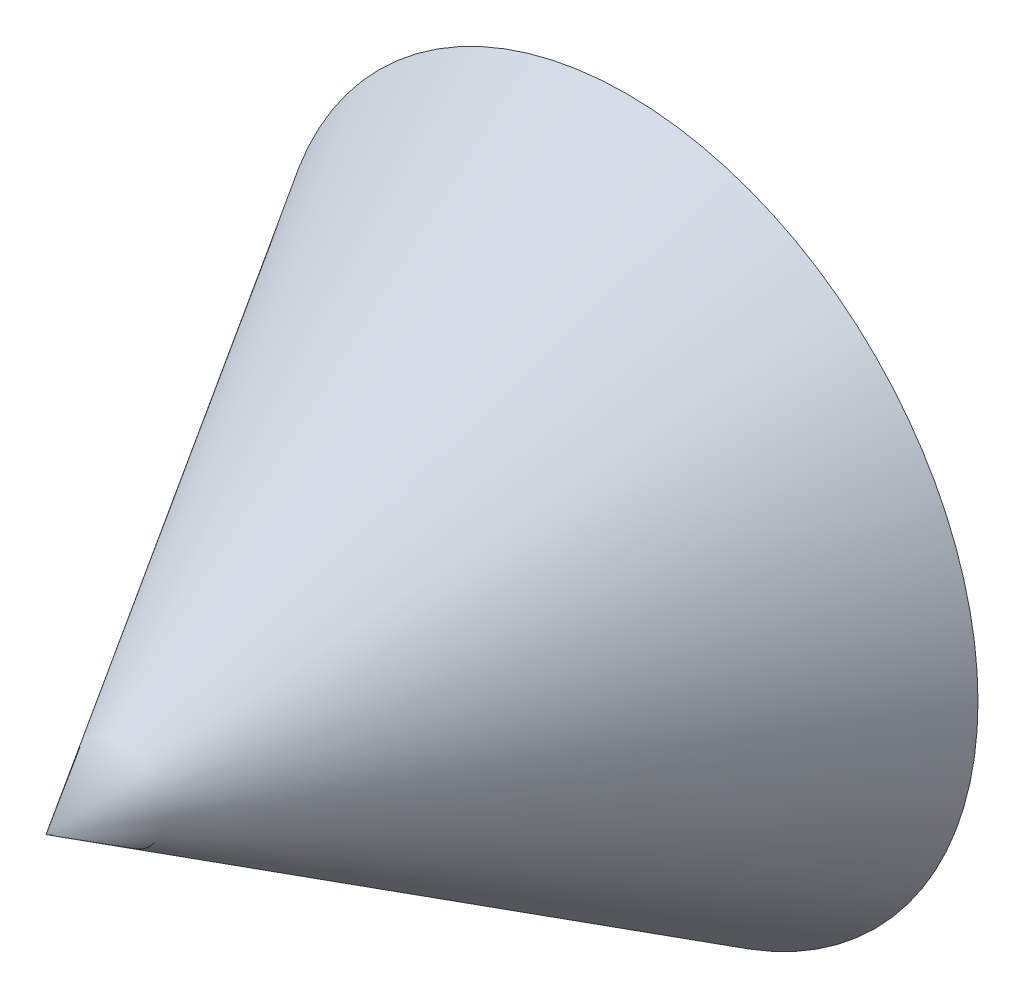
ISO-10303-21;
HEADER;
FILE_DESCRIPTION(('STEP AP214'),'2;1');
FILE_NAME('part.step','',(''),(''),'','','');
FILE_SCHEMA(('AUTOMOTIVE_DESIGN { 1 0 10303 214 1 1 1 1 }'));
ENDSEC;
DATA;
#1=APPLICATION_CONTEXT('core data for automotive mechanical design processes');
#2=APPLICATION_PROTOCOL_DEFINITION('international standard','automotive_design',2000,#1);
#3=PRODUCT_CONTEXT('',#1,'mechanical');
#4=PRODUCT('Part','Part','',(#3));
#5=PRODUCT_RELATED_PRODUCT_CATEGORY('part','',(#4));
#6=PRODUCT_DEFINITION_FORMATION('','',#4);
#7=PRODUCT_DEFINITION_CONTEXT('part definition',#1,'design');
#8=PRODUCT_DEFINITION('design','',#6,#7);
#9=PRODUCT_DEFINITION_SHAPE('','',#8);
#10=(LENGTH_UNIT() NAMED_UNIT(*) SI_UNIT(.MILLI.,.METRE.));
#11=(NAMED_UNIT(*) PLANE_ANGLE_UNIT() SI_UNIT($,.RADIAN.));
#12=(NAMED_UNIT(*) SI_UNIT($,.STERADIAN.) SOLID_ANGLE_UNIT());
#13=UNCERTAINTY_MEASURE_WITH_UNIT(LENGTH_MEASURE(1.E-05),#10,'distance_accuracy_value','');
#14=(GEOMETRIC_REPRESENTATION_CONTEXT(3) GLOBAL_UNCERTAINTY_ASSIGNED_CONTEXT((#13)) GLOBAL_UNIT_ASSIGNED_CONTEXT((#10,
#11,#12)) REPRESENTATION_CONTEXT('',''));
#15=CARTESIAN_POINT('',(0.,0.,0.));
#16=DIRECTION('',(0.,0.,1.));
#17=DIRECTION('',(1.,0.,0.));
#18=AXIS2_PLACEMENT_3D('',#15,#16,#17);
#19=CARTESIAN_POINT('',(0.,0.,0.));
#20=DIRECTION('',(0.,0.,-1.));
#21=DIRECTION('',(-1.,0.,0.));
#22=AXIS2_PLACEMENT_3D('',#19,#20,#21);
#23=CONICAL_SURFACE('',#22,0.,0.54279739737023);
#24=CARTESIAN_POINT('',(0.,0.,-200.));
#25=DIRECTION('',(0.,0.,1.));
#26=DIRECTION('',(1.,0.,0.));
#27=AXIS2_PLACEMENT_3D('',#24,#25,#26);
#28=CIRCLE('',#27,120.64771334933);
#29=CARTESIAN_POINT('',(120.64771334933,0.,-200.));
#30=VERTEX_POINT('',#29);
#31=EDGE_CURVE('E11',#30,#30,#28,.T.);
#32=ORIENTED_EDGE('',*,*,#31,.T.);
#33=EDGE_LOOP('',(#32));
#34=FACE_BOUND('',#33,.T.);
#35=CARTESIAN_POINT('',(0.,0.,0.));
#36=VERTEX_POINT('',#35);
#37=VERTEX_LOOP('',#36);
#38=FACE_BOUND('',#37,.T.);
#39=ADVANCED_FACE('F36',(#34,#38),#23,.T.);
#40=CARTESIAN_POINT('',(0.,0.,-200.));
#41=DIRECTION('',(0.,0.,-1.));
#42=DIRECTION('',(-1.,0.,0.));
#43=AXIS2_PLACEMENT_3D('',#40,#41,#42);
#44=PLANE('',#43);
#45=ORIENTED_EDGE('',*,*,#31,.F.);
#46=EDGE_LOOP('',(#45));
#47=FACE_BOUND('',#46,.T.);
#48=ADVANCED_FACE('F44',(#47),#44,.T.);
#49=CLOSED_SHELL('',(#39,#48));
#50=MANIFOLD_SOLID_BREP('B2',#49);
#51=ADVANCED_BREP_SHAPE_REPRESENTATION('',(#18,#50),#14);
#52=SHAPE_DEFINITION_REPRESENTATION(#9,#51);
ENDSEC;
END-ISO-10303-21;
